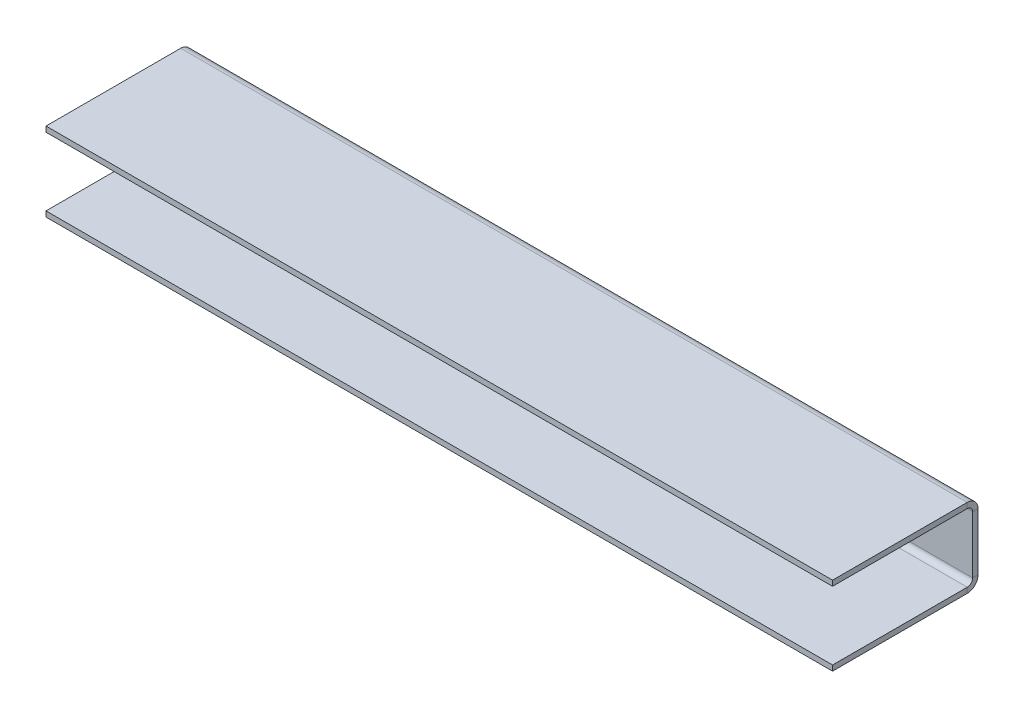
ISO-10303-21;
HEADER;
FILE_DESCRIPTION(('STEP AP214'),'2;1');
FILE_NAME('part.step','',(''),(''),'','','');
FILE_SCHEMA(('AUTOMOTIVE_DESIGN { 1 0 10303 214 1 1 1 1 }'));
ENDSEC;
DATA;
#1=APPLICATION_CONTEXT('core data for automotive mechanical design processes');
#2=APPLICATION_PROTOCOL_DEFINITION('international standard','automotive_design',2000,#1);
#3=PRODUCT_CONTEXT('',#1,'mechanical');
#4=PRODUCT('Part','Part','',(#3));
#5=PRODUCT_RELATED_PRODUCT_CATEGORY('part','',(#4));
#6=PRODUCT_DEFINITION_FORMATION('','',#4);
#7=PRODUCT_DEFINITION_CONTEXT('part definition',#1,'design');
#8=PRODUCT_DEFINITION('design','',#6,#7);
#9=PRODUCT_DEFINITION_SHAPE('','',#8);
#10=(LENGTH_UNIT() NAMED_UNIT(*) SI_UNIT(.MILLI.,.METRE.));
#11=(NAMED_UNIT(*) PLANE_ANGLE_UNIT() SI_UNIT($,.RADIAN.));
#12=(NAMED_UNIT(*) SI_UNIT($,.STERADIAN.) SOLID_ANGLE_UNIT());
#13=UNCERTAINTY_MEASURE_WITH_UNIT(LENGTH_MEASURE(1.E-05),#10,'distance_accuracy_value','');
#14=(GEOMETRIC_REPRESENTATION_CONTEXT(3) GLOBAL_UNCERTAINTY_ASSIGNED_CONTEXT((#13)) GLOBAL_UNIT_ASSIGNED_CONTEXT((#10,
#11,#12)) REPRESENTATION_CONTEXT('',''));
#15=CARTESIAN_POINT('',(0.,0.,0.));
#16=DIRECTION('',(0.,0.,1.));
#17=DIRECTION('',(1.,0.,0.));
#18=AXIS2_PLACEMENT_3D('',#15,#16,#17);
#19=CARTESIAN_POINT('',(463.55,3.175,-82.55));
#20=DIRECTION('',(1.,0.,0.));
#21=DIRECTION('',(0.,0.,-1.));
#22=AXIS2_PLACEMENT_3D('',#19,#20,#21);
#23=PLANE('',#22);
#24=DIRECTION('',(0.,0.,-1.));
#25=VECTOR('',#24,1.);
#26=CARTESIAN_POINT('',(463.55,3.175,-82.55));
#27=LINE('',#26,#25);
#28=CARTESIAN_POINT('',(463.55,3.175,-82.55));
#29=VERTEX_POINT('',#28);
#30=CARTESIAN_POINT('',(463.55,3.175,-85.725));
#31=VERTEX_POINT('',#30);
#32=EDGE_CURVE('E11',#29,#31,#27,.T.);
#33=ORIENTED_EDGE('',*,*,#32,.F.);
#34=CARTESIAN_POINT('',(463.55,3.175,-79.375));
#35=DIRECTION('',(-1.,0.,0.));
#36=DIRECTION('',(0.,0.,1.));
#37=AXIS2_PLACEMENT_3D('',#34,#35,#36);
#38=CIRCLE('',#37,3.175);
#39=CARTESIAN_POINT('',(463.55,0.,-79.375));
#40=VERTEX_POINT('',#39);
#41=EDGE_CURVE('E247',#40,#29,#38,.F.);
#42=ORIENTED_EDGE('',*,*,#41,.F.);
#43=DIRECTION('',(0.,1.,0.));
#44=VECTOR('',#43,1.);
#45=CARTESIAN_POINT('',(463.55,-3.175,-79.375));
#46=LINE('',#45,#44);
#47=CARTESIAN_POINT('',(463.55,-3.175,-79.375));
#48=VERTEX_POINT('',#47);
#49=EDGE_CURVE('E45',#48,#40,#46,.T.);
#50=ORIENTED_EDGE('',*,*,#49,.F.);
#51=CARTESIAN_POINT('',(463.55,3.175,-79.375));
#52=DIRECTION('',(1.,0.,0.));
#53=DIRECTION('',(0.,0.,-1.));
#54=AXIS2_PLACEMENT_3D('',#51,#52,#53);
#55=CIRCLE('',#54,6.35);
#56=EDGE_CURVE('E146',#48,#31,#55,.T.);
#57=ORIENTED_EDGE('',*,*,#56,.T.);
#58=EDGE_LOOP('',(#33,#42,#50,#57));
#59=FACE_BOUND('',#58,.T.);
#60=ADVANCED_FACE('F37',(#59),#23,.T.);
#61=CARTESIAN_POINT('',(463.55,-3.175,-79.375));
#62=DIRECTION('',(1.,0.,0.));
#63=DIRECTION('',(0.,0.,-1.));
#64=AXIS2_PLACEMENT_3D('',#61,#62,#63);
#65=PLANE('',#64);
#66=DIRECTION('',(0.,1.,0.));
#67=VECTOR('',#66,1.);
#68=CARTESIAN_POINT('',(463.55,0.,-82.55));
#69=LINE('',#68,#67);
#70=CARTESIAN_POINT('',(463.55,36.957,-82.55));
#71=VERTEX_POINT('',#70);
#72=EDGE_CURVE('E140',#29,#71,#69,.T.);
#73=ORIENTED_EDGE('',*,*,#72,.F.);
#74=ORIENTED_EDGE('',*,*,#32,.T.);
#75=DIRECTION('',(0.,1.,0.));
#76=VECTOR('',#75,1.);
#77=CARTESIAN_POINT('',(463.55,0.,-85.725));
#78=LINE('',#77,#76);
#79=CARTESIAN_POINT('',(463.55,36.957,-85.725));
#80=VERTEX_POINT('',#79);
#81=EDGE_CURVE('E137',#31,#80,#78,.T.);
#82=ORIENTED_EDGE('',*,*,#81,.T.);
#83=DIRECTION('',(0.,0.,1.));
#84=VECTOR('',#83,1.);
#85=CARTESIAN_POINT('',(463.55,36.957,-85.725));
#86=LINE('',#85,#84);
#87=EDGE_CURVE('E228',#80,#71,#86,.T.);
#88=ORIENTED_EDGE('',*,*,#87,.T.);
#89=EDGE_LOOP('',(#73,#74,#82,#88));
#90=FACE_BOUND('',#89,.T.);
#91=ADVANCED_FACE('F135',(#90),#65,.T.);
#92=CARTESIAN_POINT('',(0.,0.,-79.375));
#93=DIRECTION('',(-1.,0.,0.));
#94=DIRECTION('',(0.,0.,1.));
#95=AXIS2_PLACEMENT_3D('',#92,#93,#94);
#96=PLANE('',#95);
#97=DIRECTION('',(0.,-1.,0.));
#98=VECTOR('',#97,1.);
#99=CARTESIAN_POINT('',(0.,0.,-79.375));
#100=LINE('',#99,#98);
#101=CARTESIAN_POINT('',(0.,0.,-79.375));
#102=VERTEX_POINT('',#101);
#103=CARTESIAN_POINT('',(0.,-3.175,-79.375));
#104=VERTEX_POINT('',#103);
#105=EDGE_CURVE('E233',#102,#104,#100,.T.);
#106=ORIENTED_EDGE('',*,*,#105,.F.);
#107=CARTESIAN_POINT('',(0.,3.175,-79.375));
#108=DIRECTION('',(-1.,0.,0.));
#109=DIRECTION('',(0.,0.,1.));
#110=AXIS2_PLACEMENT_3D('',#107,#108,#109);
#111=CIRCLE('',#110,3.175);
#112=CARTESIAN_POINT('',(0.,3.175,-82.55));
#113=VERTEX_POINT('',#112);
#114=EDGE_CURVE('E185',#102,#113,#111,.F.);
#115=ORIENTED_EDGE('',*,*,#114,.T.);
#116=DIRECTION('',(0.,0.,1.));
#117=VECTOR('',#116,1.);
#118=CARTESIAN_POINT('',(0.,3.175,-85.725));
#119=LINE('',#118,#117);
#120=CARTESIAN_POINT('',(0.,3.175,-85.725));
#121=VERTEX_POINT('',#120);
#122=EDGE_CURVE('E231',#121,#113,#119,.T.);
#123=ORIENTED_EDGE('',*,*,#122,.F.);
#124=CARTESIAN_POINT('',(0.,3.175,-79.375));
#125=DIRECTION('',(1.,0.,0.));
#126=DIRECTION('',(0.,0.,-1.));
#127=AXIS2_PLACEMENT_3D('',#124,#125,#126);
#128=CIRCLE('',#127,6.35);
#129=EDGE_CURVE('E158',#104,#121,#128,.T.);
#130=ORIENTED_EDGE('',*,*,#129,.F.);
#131=EDGE_LOOP('',(#106,#115,#123,#130));
#132=FACE_BOUND('',#131,.T.);
#133=ADVANCED_FACE('F285',(#132),#96,.T.);
#134=CARTESIAN_POINT('',(0.,3.175,-85.725));
#135=DIRECTION('',(-1.,0.,0.));
#136=DIRECTION('',(0.,0.,1.));
#137=AXIS2_PLACEMENT_3D('',#134,#135,#136);
#138=PLANE('',#137);
#139=DIRECTION('',(0.,0.,-1.));
#140=VECTOR('',#139,1.);
#141=CARTESIAN_POINT('',(0.,0.,0.));
#142=LINE('',#141,#140);
#143=CARTESIAN_POINT('',(0.,0.,0.));
#144=VERTEX_POINT('',#143);
#145=EDGE_CURVE('E188',#144,#102,#142,.T.);
#146=ORIENTED_EDGE('',*,*,#145,.T.);
#147=ORIENTED_EDGE('',*,*,#105,.T.);
#148=DIRECTION('',(0.,0.,-1.));
#149=VECTOR('',#148,1.);
#150=CARTESIAN_POINT('',(0.,-3.175,0.));
#151=LINE('',#150,#149);
#152=CARTESIAN_POINT('',(0.,-3.175,0.));
#153=VERTEX_POINT('',#152);
#154=EDGE_CURVE('E194',#153,#104,#151,.T.);
#155=ORIENTED_EDGE('',*,*,#154,.F.);
#156=DIRECTION('',(0.,1.,0.));
#157=VECTOR('',#156,1.);
#158=CARTESIAN_POINT('',(0.,-3.175,0.));
#159=LINE('',#158,#157);
#160=EDGE_CURVE('E191',#153,#144,#159,.T.);
#161=ORIENTED_EDGE('',*,*,#160,.T.);
#162=EDGE_LOOP('',(#146,#147,#155,#161));
#163=FACE_BOUND('',#162,.T.);
#164=ADVANCED_FACE('F288',(#163),#138,.T.);
#165=CARTESIAN_POINT('',(463.55,40.132,-79.375));
#166=DIRECTION('',(1.,0.,0.));
#167=DIRECTION('',(0.,0.,-1.));
#168=AXIS2_PLACEMENT_3D('',#165,#166,#167);
#169=PLANE('',#168);
#170=DIRECTION('',(0.,1.,0.));
#171=VECTOR('',#170,1.);
#172=CARTESIAN_POINT('',(463.55,40.132,-79.375));
#173=LINE('',#172,#171);
#174=CARTESIAN_POINT('',(463.55,40.132,-79.375));
#175=VERTEX_POINT('',#174);
#176=CARTESIAN_POINT('',(463.55,43.307,-79.375));
#177=VERTEX_POINT('',#176);
#178=EDGE_CURVE('E53',#175,#177,#173,.T.);
#179=ORIENTED_EDGE('',*,*,#178,.F.);
#180=CARTESIAN_POINT('',(463.55,36.957,-79.375));
#181=DIRECTION('',(-1.,0.,0.));
#182=DIRECTION('',(0.,0.,1.));
#183=AXIS2_PLACEMENT_3D('',#180,#181,#182);
#184=CIRCLE('',#183,3.175);
#185=EDGE_CURVE('E257',#71,#175,#184,.F.);
#186=ORIENTED_EDGE('',*,*,#185,.F.);
#187=ORIENTED_EDGE('',*,*,#87,.F.);
#188=CARTESIAN_POINT('',(463.55,36.957,-79.375));
#189=DIRECTION('',(1.,0.,0.));
#190=DIRECTION('',(0.,0.,-1.));
#191=AXIS2_PLACEMENT_3D('',#188,#189,#190);
#192=CIRCLE('',#191,6.35);
#193=EDGE_CURVE('E166',#80,#177,#192,.T.);
#194=ORIENTED_EDGE('',*,*,#193,.T.);
#195=EDGE_LOOP('',(#179,#186,#187,#194));
#196=FACE_BOUND('',#195,.T.);
#197=ADVANCED_FACE('F280',(#196),#169,.T.);
#198=CARTESIAN_POINT('',(463.55,36.957,-85.725));
#199=DIRECTION('',(1.,0.,0.));
#200=DIRECTION('',(0.,0.,-1.));
#201=AXIS2_PLACEMENT_3D('',#198,#199,#200);
#202=PLANE('',#201);
#203=DIRECTION('',(0.,0.,1.));
#204=VECTOR('',#203,1.);
#205=CARTESIAN_POINT('',(463.55,40.132,-82.55));
#206=LINE('',#205,#204);
#207=CARTESIAN_POINT('',(463.55,40.132,0.));
#208=VERTEX_POINT('',#207);
#209=EDGE_CURVE('E260',#175,#208,#206,.T.);
#210=ORIENTED_EDGE('',*,*,#209,.F.);
#211=ORIENTED_EDGE('',*,*,#178,.T.);
#212=DIRECTION('',(0.,0.,1.));
#213=VECTOR('',#212,1.);
#214=CARTESIAN_POINT('',(463.55,43.307,-82.55));
#215=LINE('',#214,#213);
#216=CARTESIAN_POINT('',(463.55,43.307,0.));
#217=VERTEX_POINT('',#216);
#218=EDGE_CURVE('E107',#177,#217,#215,.T.);
#219=ORIENTED_EDGE('',*,*,#218,.T.);
#220=DIRECTION('',(0.,1.,0.));
#221=VECTOR('',#220,1.);
#222=CARTESIAN_POINT('',(463.55,40.132,0.));
#223=LINE('',#222,#221);
#224=EDGE_CURVE('E263',#208,#217,#223,.T.);
#225=ORIENTED_EDGE('',*,*,#224,.F.);
#226=EDGE_LOOP('',(#210,#211,#219,#225));
#227=FACE_BOUND('',#226,.T.);
#228=ADVANCED_FACE('F269',(#227),#202,.T.);
#229=CARTESIAN_POINT('',(0.,36.957,-82.55));
#230=DIRECTION('',(-1.,0.,0.));
#231=DIRECTION('',(0.,0.,1.));
#232=AXIS2_PLACEMENT_3D('',#229,#230,#231);
#233=PLANE('',#232);
#234=DIRECTION('',(0.,0.,-1.));
#235=VECTOR('',#234,1.);
#236=CARTESIAN_POINT('',(0.,36.957,-82.55));
#237=LINE('',#236,#235);
#238=CARTESIAN_POINT('',(0.,36.957,-82.55));
#239=VERTEX_POINT('',#238);
#240=CARTESIAN_POINT('',(0.,36.957,-85.725));
#241=VERTEX_POINT('',#240);
#242=EDGE_CURVE('E94',#239,#241,#237,.T.);
#243=ORIENTED_EDGE('',*,*,#242,.F.);
#244=CARTESIAN_POINT('',(0.,36.957,-79.375));
#245=DIRECTION('',(-1.,0.,0.));
#246=DIRECTION('',(0.,0.,1.));
#247=AXIS2_PLACEMENT_3D('',#244,#245,#246);
#248=CIRCLE('',#247,3.175);
#249=CARTESIAN_POINT('',(0.,40.132,-79.375));
#250=VERTEX_POINT('',#249);
#251=EDGE_CURVE('E181',#239,#250,#248,.F.);
#252=ORIENTED_EDGE('',*,*,#251,.T.);
#253=DIRECTION('',(0.,-1.,0.));
#254=VECTOR('',#253,1.);
#255=CARTESIAN_POINT('',(0.,43.307,-79.375));
#256=LINE('',#255,#254);
#257=CARTESIAN_POINT('',(0.,43.307,-79.375));
#258=VERTEX_POINT('',#257);
#259=EDGE_CURVE('E101',#258,#250,#256,.T.);
#260=ORIENTED_EDGE('',*,*,#259,.F.);
#261=CARTESIAN_POINT('',(0.,36.957,-79.375));
#262=DIRECTION('',(1.,0.,0.));
#263=DIRECTION('',(0.,0.,-1.));
#264=AXIS2_PLACEMENT_3D('',#261,#262,#263);
#265=CIRCLE('',#264,6.35);
#266=EDGE_CURVE('E200',#241,#258,#265,.T.);
#267=ORIENTED_EDGE('',*,*,#266,.F.);
#268=EDGE_LOOP('',(#243,#252,#260,#267));
#269=FACE_BOUND('',#268,.T.);
#270=ADVANCED_FACE('F317',(#269),#233,.T.);
#271=CARTESIAN_POINT('',(0.,43.307,-79.375));
#272=DIRECTION('',(-1.,0.,0.));
#273=DIRECTION('',(0.,0.,1.));
#274=AXIS2_PLACEMENT_3D('',#271,#272,#273);
#275=PLANE('',#274);
#276=DIRECTION('',(0.,1.,0.));
#277=VECTOR('',#276,1.);
#278=CARTESIAN_POINT('',(0.,0.,-82.55));
#279=LINE('',#278,#277);
#280=EDGE_CURVE('E183',#113,#239,#279,.T.);
#281=ORIENTED_EDGE('',*,*,#280,.T.);
#282=ORIENTED_EDGE('',*,*,#242,.T.);
#283=DIRECTION('',(0.,1.,0.));
#284=VECTOR('',#283,1.);
#285=CARTESIAN_POINT('',(0.,0.,-85.725));
#286=LINE('',#285,#284);
#287=EDGE_CURVE('E198',#121,#241,#286,.T.);
#288=ORIENTED_EDGE('',*,*,#287,.F.);
#289=ORIENTED_EDGE('',*,*,#122,.T.);
#290=EDGE_LOOP('',(#281,#282,#288,#289));
#291=FACE_BOUND('',#290,.T.);
#292=ADVANCED_FACE('F320',(#291),#275,.T.);
#293=CARTESIAN_POINT('',(463.55,43.307,-82.55));
#294=DIRECTION('',(0.,-1.,0.));
#295=DIRECTION('',(0.,0.,-1.));
#296=AXIS2_PLACEMENT_3D('',#293,#294,#295);
#297=PLANE('',#296);
#298=DIRECTION('',(0.,0.,1.));
#299=VECTOR('',#298,1.);
#300=CARTESIAN_POINT('',(0.,43.307,-82.55));
#301=LINE('',#300,#299);
#302=CARTESIAN_POINT('',(0.,43.307,0.));
#303=VERTEX_POINT('',#302);
#304=EDGE_CURVE('E172',#258,#303,#301,.T.);
#305=ORIENTED_EDGE('',*,*,#304,.T.);
#306=DIRECTION('',(-1.,0.,0.));
#307=VECTOR('',#306,1.);
#308=CARTESIAN_POINT('',(463.55,43.307,0.));
#309=LINE('',#308,#307);
#310=EDGE_CURVE('E224',#217,#303,#309,.T.);
#311=ORIENTED_EDGE('',*,*,#310,.F.);
#312=ORIENTED_EDGE('',*,*,#218,.F.);
#313=DIRECTION('',(-1.,0.,0.));
#314=VECTOR('',#313,1.);
#315=CARTESIAN_POINT('',(463.55,43.307,-79.375));
#316=LINE('',#315,#314);
#317=EDGE_CURVE('E168',#177,#258,#316,.T.);
#318=ORIENTED_EDGE('',*,*,#317,.T.);
#319=EDGE_LOOP('',(#305,#311,#312,#318));
#320=FACE_BOUND('',#319,.T.);
#321=ADVANCED_FACE('F323',(#320),#297,.F.);
#322=CARTESIAN_POINT('',(463.55,40.132,0.));
#323=DIRECTION('',(0.,0.,1.));
#324=DIRECTION('',(1.,0.,0.));
#325=AXIS2_PLACEMENT_3D('',#322,#323,#324);
#326=PLANE('',#325);
#327=DIRECTION('',(0.,1.,0.));
#328=VECTOR('',#327,1.);
#329=CARTESIAN_POINT('',(0.,40.132,0.));
#330=LINE('',#329,#328);
#331=CARTESIAN_POINT('',(0.,40.132,0.));
#332=VERTEX_POINT('',#331);
#333=EDGE_CURVE('E175',#332,#303,#330,.T.);
#334=ORIENTED_EDGE('',*,*,#333,.F.);
#335=DIRECTION('',(-1.,0.,0.));
#336=VECTOR('',#335,1.);
#337=CARTESIAN_POINT('',(463.55,40.132,0.));
#338=LINE('',#337,#336);
#339=EDGE_CURVE('E222',#208,#332,#338,.T.);
#340=ORIENTED_EDGE('',*,*,#339,.F.);
#341=ORIENTED_EDGE('',*,*,#224,.T.);
#342=ORIENTED_EDGE('',*,*,#310,.T.);
#343=EDGE_LOOP('',(#334,#340,#341,#342));
#344=FACE_BOUND('',#343,.T.);
#345=ADVANCED_FACE('F268',(#344),#326,.T.);
#346=CARTESIAN_POINT('',(463.55,40.132,-82.55));
#347=DIRECTION('',(0.,-1.,0.));
#348=DIRECTION('',(0.,0.,-1.));
#349=AXIS2_PLACEMENT_3D('',#346,#347,#348);
#350=PLANE('',#349);
#351=DIRECTION('',(0.,0.,1.));
#352=VECTOR('',#351,1.);
#353=CARTESIAN_POINT('',(0.,40.132,-82.55));
#354=LINE('',#353,#352);
#355=EDGE_CURVE('E178',#250,#332,#354,.T.);
#356=ORIENTED_EDGE('',*,*,#355,.F.);
#357=DIRECTION('',(-1.,0.,0.));
#358=VECTOR('',#357,1.);
#359=CARTESIAN_POINT('',(463.55,40.132,-79.375));
#360=LINE('',#359,#358);
#361=EDGE_CURVE('E219',#175,#250,#360,.T.);
#362=ORIENTED_EDGE('',*,*,#361,.F.);
#363=ORIENTED_EDGE('',*,*,#209,.T.);
#364=ORIENTED_EDGE('',*,*,#339,.T.);
#365=EDGE_LOOP('',(#356,#362,#363,#364));
#366=FACE_BOUND('',#365,.T.);
#367=ADVANCED_FACE('F273',(#366),#350,.T.);
#368=CARTESIAN_POINT('',(463.55,36.957,-79.375));
#369=DIRECTION('',(-1.,0.,0.));
#370=DIRECTION('',(0.,0.,1.));
#371=AXIS2_PLACEMENT_3D('',#368,#369,#370);
#372=CYLINDRICAL_SURFACE('',#371,3.175);
#373=ORIENTED_EDGE('',*,*,#251,.F.);
#374=DIRECTION('',(-1.,0.,0.));
#375=VECTOR('',#374,1.);
#376=CARTESIAN_POINT('',(463.55,36.957,-82.55));
#377=LINE('',#376,#375);
#378=EDGE_CURVE('E216',#71,#239,#377,.T.);
#379=ORIENTED_EDGE('',*,*,#378,.F.);
#380=ORIENTED_EDGE('',*,*,#185,.T.);
#381=ORIENTED_EDGE('',*,*,#361,.T.);
#382=EDGE_LOOP('',(#373,#379,#380,#381));
#383=FACE_BOUND('',#382,.T.);
#384=ADVANCED_FACE('F276',(#383),#372,.F.);
#385=CARTESIAN_POINT('',(463.55,0.,-82.55));
#386=DIRECTION('',(0.,0.,1.));
#387=DIRECTION('',(1.,0.,0.));
#388=AXIS2_PLACEMENT_3D('',#385,#386,#387);
#389=PLANE('',#388);
#390=ORIENTED_EDGE('',*,*,#280,.F.);
#391=DIRECTION('',(-1.,0.,0.));
#392=VECTOR('',#391,1.);
#393=CARTESIAN_POINT('',(463.55,3.175,-82.55));
#394=LINE('',#393,#392);
#395=EDGE_CURVE('E213',#29,#113,#394,.T.);
#396=ORIENTED_EDGE('',*,*,#395,.F.);
#397=ORIENTED_EDGE('',*,*,#72,.T.);
#398=ORIENTED_EDGE('',*,*,#378,.T.);
#399=EDGE_LOOP('',(#390,#396,#397,#398));
#400=FACE_BOUND('',#399,.T.);
#401=ADVANCED_FACE('F283',(#400),#389,.T.);
#402=CARTESIAN_POINT('',(463.55,3.175,-79.375));
#403=DIRECTION('',(-1.,0.,0.));
#404=DIRECTION('',(0.,0.,1.));
#405=AXIS2_PLACEMENT_3D('',#402,#403,#404);
#406=CYLINDRICAL_SURFACE('',#405,3.175);
#407=ORIENTED_EDGE('',*,*,#114,.F.);
#408=DIRECTION('',(-1.,0.,0.));
#409=VECTOR('',#408,1.);
#410=CARTESIAN_POINT('',(463.55,0.,-79.375));
#411=LINE('',#410,#409);
#412=EDGE_CURVE('E210',#40,#102,#411,.T.);
#413=ORIENTED_EDGE('',*,*,#412,.F.);
#414=ORIENTED_EDGE('',*,*,#41,.T.);
#415=ORIENTED_EDGE('',*,*,#395,.T.);
#416=EDGE_LOOP('',(#407,#413,#414,#415));
#417=FACE_BOUND('',#416,.T.);
#418=ADVANCED_FACE('F246',(#417),#406,.F.);
#419=CARTESIAN_POINT('',(463.55,0.,0.));
#420=DIRECTION('',(0.,1.,0.));
#421=DIRECTION('',(0.,0.,1.));
#422=AXIS2_PLACEMENT_3D('',#419,#420,#421);
#423=PLANE('',#422);
#424=ORIENTED_EDGE('',*,*,#145,.F.);
#425=DIRECTION('',(-1.,0.,0.));
#426=VECTOR('',#425,1.);
#427=CARTESIAN_POINT('',(463.55,0.,0.));
#428=LINE('',#427,#426);
#429=CARTESIAN_POINT('',(463.55,0.,0.));
#430=VERTEX_POINT('',#429);
#431=EDGE_CURVE('E208',#430,#144,#428,.T.);
#432=ORIENTED_EDGE('',*,*,#431,.F.);
#433=DIRECTION('',(0.,0.,-1.));
#434=VECTOR('',#433,1.);
#435=CARTESIAN_POINT('',(463.55,0.,0.));
#436=LINE('',#435,#434);
#437=EDGE_CURVE('E240',#430,#40,#436,.T.);
#438=ORIENTED_EDGE('',*,*,#437,.T.);
#439=ORIENTED_EDGE('',*,*,#412,.T.);
#440=EDGE_LOOP('',(#424,#432,#438,#439));
#441=FACE_BOUND('',#440,.T.);
#442=ADVANCED_FACE('F251',(#441),#423,.T.);
#443=CARTESIAN_POINT('',(463.55,-3.175,0.));
#444=DIRECTION('',(0.,0.,1.));
#445=DIRECTION('',(1.,0.,0.));
#446=AXIS2_PLACEMENT_3D('',#443,#444,#445);
#447=PLANE('',#446);
#448=ORIENTED_EDGE('',*,*,#160,.F.);
#449=DIRECTION('',(-1.,0.,0.));
#450=VECTOR('',#449,1.);
#451=CARTESIAN_POINT('',(463.55,-3.175,0.));
#452=LINE('',#451,#450);
#453=CARTESIAN_POINT('',(463.55,-3.175,0.));
#454=VERTEX_POINT('',#453);
#455=EDGE_CURVE('E206',#454,#153,#452,.T.);
#456=ORIENTED_EDGE('',*,*,#455,.F.);
#457=DIRECTION('',(0.,1.,0.));
#458=VECTOR('',#457,1.);
#459=CARTESIAN_POINT('',(463.55,-3.175,0.));
#460=LINE('',#459,#458);
#461=EDGE_CURVE('E252',#454,#430,#460,.T.);
#462=ORIENTED_EDGE('',*,*,#461,.T.);
#463=ORIENTED_EDGE('',*,*,#431,.T.);
#464=EDGE_LOOP('',(#448,#456,#462,#463));
#465=FACE_BOUND('',#464,.T.);
#466=ADVANCED_FACE('F293',(#465),#447,.T.);
#467=CARTESIAN_POINT('',(463.55,-3.175,0.));
#468=DIRECTION('',(0.,1.,0.));
#469=DIRECTION('',(0.,0.,1.));
#470=AXIS2_PLACEMENT_3D('',#467,#468,#469);
#471=PLANE('',#470);
#472=ORIENTED_EDGE('',*,*,#154,.T.);
#473=DIRECTION('',(-1.,0.,0.));
#474=VECTOR('',#473,1.);
#475=CARTESIAN_POINT('',(463.55,-3.175,-79.375));
#476=LINE('',#475,#474);
#477=EDGE_CURVE('E160',#48,#104,#476,.T.);
#478=ORIENTED_EDGE('',*,*,#477,.F.);
#479=DIRECTION('',(0.,0.,-1.));
#480=VECTOR('',#479,1.);
#481=CARTESIAN_POINT('',(463.55,-3.175,0.));
#482=LINE('',#481,#480);
#483=EDGE_CURVE('E151',#454,#48,#482,.T.);
#484=ORIENTED_EDGE('',*,*,#483,.F.);
#485=ORIENTED_EDGE('',*,*,#455,.T.);
#486=EDGE_LOOP('',(#472,#478,#484,#485));
#487=FACE_BOUND('',#486,.T.);
#488=ADVANCED_FACE('F291',(#487),#471,.F.);
#489=CARTESIAN_POINT('',(463.55,3.175,-79.375));
#490=DIRECTION('',(-1.,0.,0.));
#491=DIRECTION('',(0.,0.,1.));
#492=AXIS2_PLACEMENT_3D('',#489,#490,#491);
#493=CYLINDRICAL_SURFACE('',#492,6.35);
#494=ORIENTED_EDGE('',*,*,#129,.T.);
#495=DIRECTION('',(-1.,0.,0.));
#496=VECTOR('',#495,1.);
#497=CARTESIAN_POINT('',(463.55,3.175,-85.725));
#498=LINE('',#497,#496);
#499=EDGE_CURVE('E155',#31,#121,#498,.T.);
#500=ORIENTED_EDGE('',*,*,#499,.F.);
#501=ORIENTED_EDGE('',*,*,#56,.F.);
#502=ORIENTED_EDGE('',*,*,#477,.T.);
#503=EDGE_LOOP('',(#494,#500,#501,#502));
#504=FACE_BOUND('',#503,.T.);
#505=ADVANCED_FACE('F156',(#504),#493,.T.);
#506=CARTESIAN_POINT('',(463.55,0.,-85.725));
#507=DIRECTION('',(0.,0.,1.));
#508=DIRECTION('',(1.,0.,0.));
#509=AXIS2_PLACEMENT_3D('',#506,#507,#508);
#510=PLANE('',#509);
#511=ORIENTED_EDGE('',*,*,#287,.T.);
#512=DIRECTION('',(-1.,0.,0.));
#513=VECTOR('',#512,1.);
#514=CARTESIAN_POINT('',(463.55,36.957,-85.725));
#515=LINE('',#514,#513);
#516=EDGE_CURVE('E161',#80,#241,#515,.T.);
#517=ORIENTED_EDGE('',*,*,#516,.F.);
#518=ORIENTED_EDGE('',*,*,#81,.F.);
#519=ORIENTED_EDGE('',*,*,#499,.T.);
#520=EDGE_LOOP('',(#511,#517,#518,#519));
#521=FACE_BOUND('',#520,.T.);
#522=ADVANCED_FACE('F163',(#521),#510,.F.);
#523=CARTESIAN_POINT('',(463.55,36.957,-79.375));
#524=DIRECTION('',(-1.,0.,0.));
#525=DIRECTION('',(0.,0.,1.));
#526=AXIS2_PLACEMENT_3D('',#523,#524,#525);
#527=CYLINDRICAL_SURFACE('',#526,6.35);
#528=ORIENTED_EDGE('',*,*,#266,.T.);
#529=ORIENTED_EDGE('',*,*,#317,.F.);
#530=ORIENTED_EDGE('',*,*,#193,.F.);
#531=ORIENTED_EDGE('',*,*,#516,.T.);
#532=EDGE_LOOP('',(#528,#529,#530,#531));
#533=FACE_BOUND('',#532,.T.);
#534=ADVANCED_FACE('F375',(#533),#527,.T.);
#535=CARTESIAN_POINT('',(463.55,36.957,-79.375));
#536=DIRECTION('',(-1.,0.,0.));
#537=DIRECTION('',(0.,0.,1.));
#538=AXIS2_PLACEMENT_3D('',#535,#536,#537);
#539=PLANE('',#538);
#540=ORIENTED_EDGE('',*,*,#483,.T.);
#541=ORIENTED_EDGE('',*,*,#49,.T.);
#542=ORIENTED_EDGE('',*,*,#437,.F.);
#543=ORIENTED_EDGE('',*,*,#461,.F.);
#544=EDGE_LOOP('',(#540,#541,#542,#543));
#545=FACE_BOUND('',#544,.T.);
#546=ADVANCED_FACE('F237',(#545),#539,.F.);
#547=CARTESIAN_POINT('',(0.,36.957,-79.375));
#548=DIRECTION('',(-1.,0.,0.));
#549=DIRECTION('',(0.,0.,1.));
#550=AXIS2_PLACEMENT_3D('',#547,#548,#549);
#551=PLANE('',#550);
#552=ORIENTED_EDGE('',*,*,#304,.F.);
#553=ORIENTED_EDGE('',*,*,#259,.T.);
#554=ORIENTED_EDGE('',*,*,#355,.T.);
#555=ORIENTED_EDGE('',*,*,#333,.T.);
#556=EDGE_LOOP('',(#552,#553,#554,#555));
#557=FACE_BOUND('',#556,.T.);
#558=ADVANCED_FACE('F395',(#557),#551,.T.);
#559=CLOSED_SHELL('',(#60,#91,#133,#164,#197,#228,#270,#292,#321,#345,#367,#384,#401,#418,#442,
#466,#488,#505,#522,#534,#546,#558));
#560=MANIFOLD_SOLID_BREP('B2',#559);
#561=ADVANCED_BREP_SHAPE_REPRESENTATION('',(#18,#560),#14);
#562=SHAPE_DEFINITION_REPRESENTATION(#9,#561);
ENDSEC;
END-ISO-10303-21;
